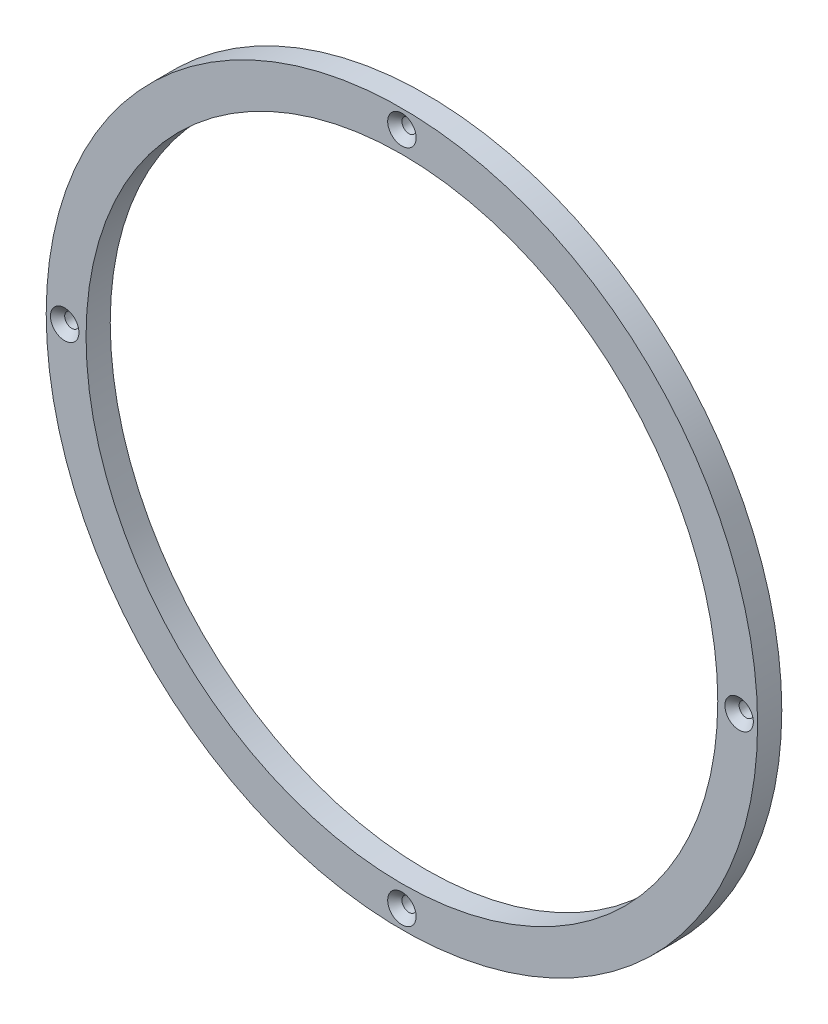
ISO-10303-21;
HEADER;
FILE_DESCRIPTION(('STEP AP214'),'2;1');
FILE_NAME('part.step','',(''),(''),'','','');
FILE_SCHEMA(('AUTOMOTIVE_DESIGN { 1 0 10303 214 1 1 1 1 }'));
ENDSEC;
DATA;
#1=APPLICATION_CONTEXT('core data for automotive mechanical design processes');
#2=APPLICATION_PROTOCOL_DEFINITION('international standard','automotive_design',2000,#1);
#3=PRODUCT_CONTEXT('',#1,'mechanical');
#4=PRODUCT('Part','Part','',(#3));
#5=PRODUCT_RELATED_PRODUCT_CATEGORY('part','',(#4));
#6=PRODUCT_DEFINITION_FORMATION('','',#4);
#7=PRODUCT_DEFINITION_CONTEXT('part definition',#1,'design');
#8=PRODUCT_DEFINITION('design','',#6,#7);
#9=PRODUCT_DEFINITION_SHAPE('','',#8);
#10=(LENGTH_UNIT() NAMED_UNIT(*) SI_UNIT(.MILLI.,.METRE.));
#11=(NAMED_UNIT(*) PLANE_ANGLE_UNIT() SI_UNIT($,.RADIAN.));
#12=(NAMED_UNIT(*) SI_UNIT($,.STERADIAN.) SOLID_ANGLE_UNIT());
#13=UNCERTAINTY_MEASURE_WITH_UNIT(LENGTH_MEASURE(1.E-05),#10,'distance_accuracy_value','');
#14=(GEOMETRIC_REPRESENTATION_CONTEXT(3) GLOBAL_UNCERTAINTY_ASSIGNED_CONTEXT((#13)) GLOBAL_UNIT_ASSIGNED_CONTEXT((#10,
#11,#12)) REPRESENTATION_CONTEXT('',''));
#15=CARTESIAN_POINT('',(0.,0.,0.));
#16=DIRECTION('',(0.,0.,1.));
#17=DIRECTION('',(1.,0.,0.));
#18=AXIS2_PLACEMENT_3D('',#15,#16,#17);
#19=CARTESIAN_POINT('',(0.,0.,8.5));
#20=DIRECTION('',(0.,0.,1.));
#21=DIRECTION('',(1.,0.,0.));
#22=AXIS2_PLACEMENT_3D('',#19,#20,#21);
#23=PLANE('',#22);
#24=CARTESIAN_POINT('',(118.5,-1.24122161595873E-12,8.5));
#25=DIRECTION('',(0.,0.,1.));
#26=DIRECTION('',(1.,0.,0.));
#27=AXIS2_PLACEMENT_3D('',#24,#25,#26);
#28=CIRCLE('',#27,5.);
#29=CARTESIAN_POINT('',(123.5,-1.24122161595873E-12,8.5));
#30=VERTEX_POINT('',#29);
#31=EDGE_CURVE('E95',#30,#30,#28,.T.);
#32=ORIENTED_EDGE('',*,*,#31,.F.);
#33=EDGE_LOOP('',(#32));
#34=FACE_BOUND('',#33,.T.);
#35=CARTESIAN_POINT('',(0.,118.5,8.5));
#36=DIRECTION('',(0.,0.,1.));
#37=DIRECTION('',(1.,0.,0.));
#38=AXIS2_PLACEMENT_3D('',#35,#36,#37);
#39=CIRCLE('',#38,5.);
#40=CARTESIAN_POINT('',(5.,118.5,8.5));
#41=VERTEX_POINT('',#40);
#42=EDGE_CURVE('E86',#41,#41,#39,.T.);
#43=ORIENTED_EDGE('',*,*,#42,.F.);
#44=EDGE_LOOP('',(#43));
#45=FACE_BOUND('',#44,.T.);
#46=CARTESIAN_POINT('',(-118.5,4.13740538652911E-13,8.5));
#47=DIRECTION('',(0.,0.,1.));
#48=DIRECTION('',(1.,0.,0.));
#49=AXIS2_PLACEMENT_3D('',#46,#47,#48);
#50=CIRCLE('',#49,5.);
#51=CARTESIAN_POINT('',(-113.5,4.13740538652911E-13,8.5));
#52=VERTEX_POINT('',#51);
#53=EDGE_CURVE('E77',#52,#52,#50,.T.);
#54=ORIENTED_EDGE('',*,*,#53,.F.);
#55=EDGE_LOOP('',(#54));
#56=FACE_BOUND('',#55,.T.);
#57=CARTESIAN_POINT('',(0.,-118.5,8.5));
#58=DIRECTION('',(0.,0.,1.));
#59=DIRECTION('',(1.,0.,0.));
#60=AXIS2_PLACEMENT_3D('',#57,#58,#59);
#61=CIRCLE('',#60,5.);
#62=CARTESIAN_POINT('',(5.,-118.5,8.5));
#63=VERTEX_POINT('',#62);
#64=EDGE_CURVE('E68',#63,#63,#61,.T.);
#65=ORIENTED_EDGE('',*,*,#64,.F.);
#66=EDGE_LOOP('',(#65));
#67=FACE_BOUND('',#66,.T.);
#68=CARTESIAN_POINT('',(0.,0.,8.5));
#69=DIRECTION('',(0.,0.,1.));
#70=DIRECTION('',(1.,0.,0.));
#71=AXIS2_PLACEMENT_3D('',#68,#69,#70);
#72=CIRCLE('',#71,125.);
#73=CARTESIAN_POINT('',(125.,0.,8.5));
#74=VERTEX_POINT('',#73);
#75=EDGE_CURVE('E11',#74,#74,#72,.T.);
#76=ORIENTED_EDGE('',*,*,#75,.T.);
#77=EDGE_LOOP('',(#76));
#78=FACE_BOUND('',#77,.T.);
#79=CARTESIAN_POINT('',(0.,0.,8.5));
#80=DIRECTION('',(0.,0.,1.));
#81=DIRECTION('',(1.,0.,0.));
#82=AXIS2_PLACEMENT_3D('',#79,#80,#81);
#83=CIRCLE('',#82,111.);
#84=CARTESIAN_POINT('',(111.,0.,8.5));
#85=VERTEX_POINT('',#84);
#86=EDGE_CURVE('E55',#85,#85,#83,.T.);
#87=ORIENTED_EDGE('',*,*,#86,.F.);
#88=EDGE_LOOP('',(#87));
#89=FACE_BOUND('',#88,.T.);
#90=ADVANCED_FACE('F44',(#34,#45,#56,#67,#78,#89),#23,.T.);
#91=CARTESIAN_POINT('',(0.,0.,0.));
#92=DIRECTION('',(0.,0.,1.));
#93=DIRECTION('',(1.,0.,0.));
#94=AXIS2_PLACEMENT_3D('',#91,#92,#93);
#95=PLANE('',#94);
#96=CARTESIAN_POINT('',(118.5,-1.24122161595873E-12,0.));
#97=DIRECTION('',(0.,0.,1.));
#98=DIRECTION('',(1.,0.,0.));
#99=AXIS2_PLACEMENT_3D('',#96,#97,#98);
#100=CIRCLE('',#99,2.5);
#101=CARTESIAN_POINT('',(121.,-1.24122161595873E-12,0.));
#102=VERTEX_POINT('',#101);
#103=EDGE_CURVE('E89',#102,#102,#100,.T.);
#104=ORIENTED_EDGE('',*,*,#103,.T.);
#105=EDGE_LOOP('',(#104));
#106=FACE_BOUND('',#105,.T.);
#107=CARTESIAN_POINT('',(0.,118.5,0.));
#108=DIRECTION('',(0.,0.,1.));
#109=DIRECTION('',(1.,0.,0.));
#110=AXIS2_PLACEMENT_3D('',#107,#108,#109);
#111=CIRCLE('',#110,2.5);
#112=CARTESIAN_POINT('',(2.5,118.5,0.));
#113=VERTEX_POINT('',#112);
#114=EDGE_CURVE('E80',#113,#113,#111,.T.);
#115=ORIENTED_EDGE('',*,*,#114,.T.);
#116=EDGE_LOOP('',(#115));
#117=FACE_BOUND('',#116,.T.);
#118=CARTESIAN_POINT('',(-118.5,4.13740538652911E-13,0.));
#119=DIRECTION('',(0.,0.,1.));
#120=DIRECTION('',(1.,0.,0.));
#121=AXIS2_PLACEMENT_3D('',#118,#119,#120);
#122=CIRCLE('',#121,2.5);
#123=CARTESIAN_POINT('',(-116.,4.13740538652911E-13,0.));
#124=VERTEX_POINT('',#123);
#125=EDGE_CURVE('E71',#124,#124,#122,.T.);
#126=ORIENTED_EDGE('',*,*,#125,.T.);
#127=EDGE_LOOP('',(#126));
#128=FACE_BOUND('',#127,.T.);
#129=CARTESIAN_POINT('',(0.,-118.5,0.));
#130=DIRECTION('',(0.,0.,1.));
#131=DIRECTION('',(1.,0.,0.));
#132=AXIS2_PLACEMENT_3D('',#129,#130,#131);
#133=CIRCLE('',#132,2.5);
#134=CARTESIAN_POINT('',(2.5,-118.5,0.));
#135=VERTEX_POINT('',#134);
#136=EDGE_CURVE('E60',#135,#135,#133,.T.);
#137=ORIENTED_EDGE('',*,*,#136,.T.);
#138=EDGE_LOOP('',(#137));
#139=FACE_BOUND('',#138,.T.);
#140=CARTESIAN_POINT('',(0.,0.,0.));
#141=DIRECTION('',(0.,0.,1.));
#142=DIRECTION('',(1.,0.,0.));
#143=AXIS2_PLACEMENT_3D('',#140,#141,#142);
#144=CIRCLE('',#143,125.);
#145=CARTESIAN_POINT('',(125.,0.,0.));
#146=VERTEX_POINT('',#145);
#147=EDGE_CURVE('E48',#146,#146,#144,.T.);
#148=ORIENTED_EDGE('',*,*,#147,.F.);
#149=EDGE_LOOP('',(#148));
#150=FACE_BOUND('',#149,.T.);
#151=CARTESIAN_POINT('',(0.,0.,0.));
#152=DIRECTION('',(0.,0.,1.));
#153=DIRECTION('',(1.,0.,0.));
#154=AXIS2_PLACEMENT_3D('',#151,#152,#153);
#155=CIRCLE('',#154,111.);
#156=CARTESIAN_POINT('',(111.,0.,0.));
#157=VERTEX_POINT('',#156);
#158=EDGE_CURVE('E57',#157,#157,#155,.T.);
#159=ORIENTED_EDGE('',*,*,#158,.T.);
#160=EDGE_LOOP('',(#159));
#161=FACE_BOUND('',#160,.T.);
#162=ADVANCED_FACE('F103',(#106,#117,#128,#139,#150,#161),#95,.F.);
#163=CARTESIAN_POINT('',(0.,0.,8.5));
#164=DIRECTION('',(0.,0.,-1.));
#165=DIRECTION('',(-1.,0.,0.));
#166=AXIS2_PLACEMENT_3D('',#163,#164,#165);
#167=CYLINDRICAL_SURFACE('',#166,125.);
#168=ORIENTED_EDGE('',*,*,#75,.F.);
#169=EDGE_LOOP('',(#168));
#170=FACE_BOUND('',#169,.T.);
#171=ORIENTED_EDGE('',*,*,#147,.T.);
#172=EDGE_LOOP('',(#171));
#173=FACE_BOUND('',#172,.T.);
#174=ADVANCED_FACE('F46',(#170,#173),#167,.T.);
#175=CARTESIAN_POINT('',(0.,0.,8.5));
#176=DIRECTION('',(0.,0.,-1.));
#177=DIRECTION('',(-1.,0.,0.));
#178=AXIS2_PLACEMENT_3D('',#175,#176,#177);
#179=CYLINDRICAL_SURFACE('',#178,111.);
#180=ORIENTED_EDGE('',*,*,#86,.T.);
#181=EDGE_LOOP('',(#180));
#182=FACE_BOUND('',#181,.T.);
#183=ORIENTED_EDGE('',*,*,#158,.F.);
#184=EDGE_LOOP('',(#183));
#185=FACE_BOUND('',#184,.T.);
#186=ADVANCED_FACE('F113',(#182,#185),#179,.F.);
#187=CARTESIAN_POINT('',(0.,-118.5,8.5));
#188=DIRECTION('',(0.,0.,1.));
#189=DIRECTION('',(1.,0.,0.));
#190=AXIS2_PLACEMENT_3D('',#187,#188,#189);
#191=CYLINDRICAL_SURFACE('',#190,2.5);
#192=ORIENTED_EDGE('',*,*,#136,.F.);
#193=EDGE_LOOP('',(#192));
#194=FACE_BOUND('',#193,.T.);
#195=CARTESIAN_POINT('',(0.,-118.5,6.));
#196=DIRECTION('',(0.,0.,1.));
#197=DIRECTION('',(1.,0.,0.));
#198=AXIS2_PLACEMENT_3D('',#195,#196,#197);
#199=CIRCLE('',#198,2.5);
#200=CARTESIAN_POINT('',(2.5,-118.5,6.));
#201=VERTEX_POINT('',#200);
#202=EDGE_CURVE('E65',#201,#201,#199,.T.);
#203=ORIENTED_EDGE('',*,*,#202,.T.);
#204=EDGE_LOOP('',(#203));
#205=FACE_BOUND('',#204,.T.);
#206=ADVANCED_FACE('F116',(#194,#205),#191,.F.);
#207=CARTESIAN_POINT('',(0.,-118.5,8.5));
#208=DIRECTION('',(0.,0.,1.));
#209=DIRECTION('',(1.,0.,0.));
#210=AXIS2_PLACEMENT_3D('',#207,#208,#209);
#211=CONICAL_SURFACE('',#210,5.,0.785398163397448);
#212=ORIENTED_EDGE('',*,*,#202,.F.);
#213=EDGE_LOOP('',(#212));
#214=FACE_BOUND('',#213,.T.);
#215=ORIENTED_EDGE('',*,*,#64,.T.);
#216=EDGE_LOOP('',(#215));
#217=FACE_BOUND('',#216,.T.);
#218=ADVANCED_FACE('F130',(#214,#217),#211,.F.);
#219=CARTESIAN_POINT('',(-118.5,4.13740538652911E-13,8.5));
#220=DIRECTION('',(0.,0.,1.));
#221=DIRECTION('',(1.,0.,0.));
#222=AXIS2_PLACEMENT_3D('',#219,#220,#221);
#223=CYLINDRICAL_SURFACE('',#222,2.5);
#224=ORIENTED_EDGE('',*,*,#125,.F.);
#225=EDGE_LOOP('',(#224));
#226=FACE_BOUND('',#225,.T.);
#227=CARTESIAN_POINT('',(-118.5,4.13740538652911E-13,6.));
#228=DIRECTION('',(0.,0.,1.));
#229=DIRECTION('',(1.,0.,0.));
#230=AXIS2_PLACEMENT_3D('',#227,#228,#229);
#231=CIRCLE('',#230,2.5);
#232=CARTESIAN_POINT('',(-116.,4.13740538652911E-13,6.));
#233=VERTEX_POINT('',#232);
#234=EDGE_CURVE('E74',#233,#233,#231,.T.);
#235=ORIENTED_EDGE('',*,*,#234,.T.);
#236=EDGE_LOOP('',(#235));
#237=FACE_BOUND('',#236,.T.);
#238=ADVANCED_FACE('F134',(#226,#237),#223,.F.);
#239=CARTESIAN_POINT('',(-118.5,4.13740538652911E-13,8.5));
#240=DIRECTION('',(0.,0.,1.));
#241=DIRECTION('',(1.,0.,0.));
#242=AXIS2_PLACEMENT_3D('',#239,#240,#241);
#243=CONICAL_SURFACE('',#242,5.,0.785398163397449);
#244=ORIENTED_EDGE('',*,*,#234,.F.);
#245=EDGE_LOOP('',(#244));
#246=FACE_BOUND('',#245,.T.);
#247=ORIENTED_EDGE('',*,*,#53,.T.);
#248=EDGE_LOOP('',(#247));
#249=FACE_BOUND('',#248,.T.);
#250=ADVANCED_FACE('F138',(#246,#249),#243,.F.);
#251=CARTESIAN_POINT('',(0.,118.5,8.5));
#252=DIRECTION('',(0.,0.,1.));
#253=DIRECTION('',(1.,0.,0.));
#254=AXIS2_PLACEMENT_3D('',#251,#252,#253);
#255=CYLINDRICAL_SURFACE('',#254,2.5);
#256=ORIENTED_EDGE('',*,*,#114,.F.);
#257=EDGE_LOOP('',(#256));
#258=FACE_BOUND('',#257,.T.);
#259=CARTESIAN_POINT('',(0.,118.5,6.));
#260=DIRECTION('',(0.,0.,1.));
#261=DIRECTION('',(1.,0.,0.));
#262=AXIS2_PLACEMENT_3D('',#259,#260,#261);
#263=CIRCLE('',#262,2.5);
#264=CARTESIAN_POINT('',(2.5,118.5,6.));
#265=VERTEX_POINT('',#264);
#266=EDGE_CURVE('E83',#265,#265,#263,.T.);
#267=ORIENTED_EDGE('',*,*,#266,.T.);
#268=EDGE_LOOP('',(#267));
#269=FACE_BOUND('',#268,.T.);
#270=ADVANCED_FACE('F142',(#258,#269),#255,.F.);
#271=CARTESIAN_POINT('',(0.,118.5,8.5));
#272=DIRECTION('',(0.,0.,1.));
#273=DIRECTION('',(1.,0.,0.));
#274=AXIS2_PLACEMENT_3D('',#271,#272,#273);
#275=CONICAL_SURFACE('',#274,5.,0.785398163397448);
#276=ORIENTED_EDGE('',*,*,#266,.F.);
#277=EDGE_LOOP('',(#276));
#278=FACE_BOUND('',#277,.T.);
#279=ORIENTED_EDGE('',*,*,#42,.T.);
#280=EDGE_LOOP('',(#279));
#281=FACE_BOUND('',#280,.T.);
#282=ADVANCED_FACE('F146',(#278,#281),#275,.F.);
#283=CARTESIAN_POINT('',(118.5,-1.24122161595873E-12,8.5));
#284=DIRECTION('',(0.,0.,1.));
#285=DIRECTION('',(1.,0.,0.));
#286=AXIS2_PLACEMENT_3D('',#283,#284,#285);
#287=CYLINDRICAL_SURFACE('',#286,2.5);
#288=ORIENTED_EDGE('',*,*,#103,.F.);
#289=EDGE_LOOP('',(#288));
#290=FACE_BOUND('',#289,.T.);
#291=CARTESIAN_POINT('',(118.5,-1.24122161595873E-12,6.));
#292=DIRECTION('',(0.,0.,1.));
#293=DIRECTION('',(1.,0.,0.));
#294=AXIS2_PLACEMENT_3D('',#291,#292,#293);
#295=CIRCLE('',#294,2.5);
#296=CARTESIAN_POINT('',(121.,-1.24122161595873E-12,6.));
#297=VERTEX_POINT('',#296);
#298=EDGE_CURVE('E92',#297,#297,#295,.T.);
#299=ORIENTED_EDGE('',*,*,#298,.T.);
#300=EDGE_LOOP('',(#299));
#301=FACE_BOUND('',#300,.T.);
#302=ADVANCED_FACE('F150',(#290,#301),#287,.F.);
#303=CARTESIAN_POINT('',(118.5,-1.24122161595873E-12,8.5));
#304=DIRECTION('',(0.,0.,1.));
#305=DIRECTION('',(1.,0.,0.));
#306=AXIS2_PLACEMENT_3D('',#303,#304,#305);
#307=CONICAL_SURFACE('',#306,5.,0.785398163397449);
#308=ORIENTED_EDGE('',*,*,#298,.F.);
#309=EDGE_LOOP('',(#308));
#310=FACE_BOUND('',#309,.T.);
#311=ORIENTED_EDGE('',*,*,#31,.T.);
#312=EDGE_LOOP('',(#311));
#313=FACE_BOUND('',#312,.T.);
#314=ADVANCED_FACE('F99',(#310,#313),#307,.F.);
#315=CLOSED_SHELL('',(#90,#162,#174,#186,#206,#218,#238,#250,#270,#282,#302,#314));
#316=MANIFOLD_SOLID_BREP('B2',#315);
#317=ADVANCED_BREP_SHAPE_REPRESENTATION('',(#18,#316),#14);
#318=SHAPE_DEFINITION_REPRESENTATION(#9,#317);
ENDSEC;
END-ISO-10303-21;
